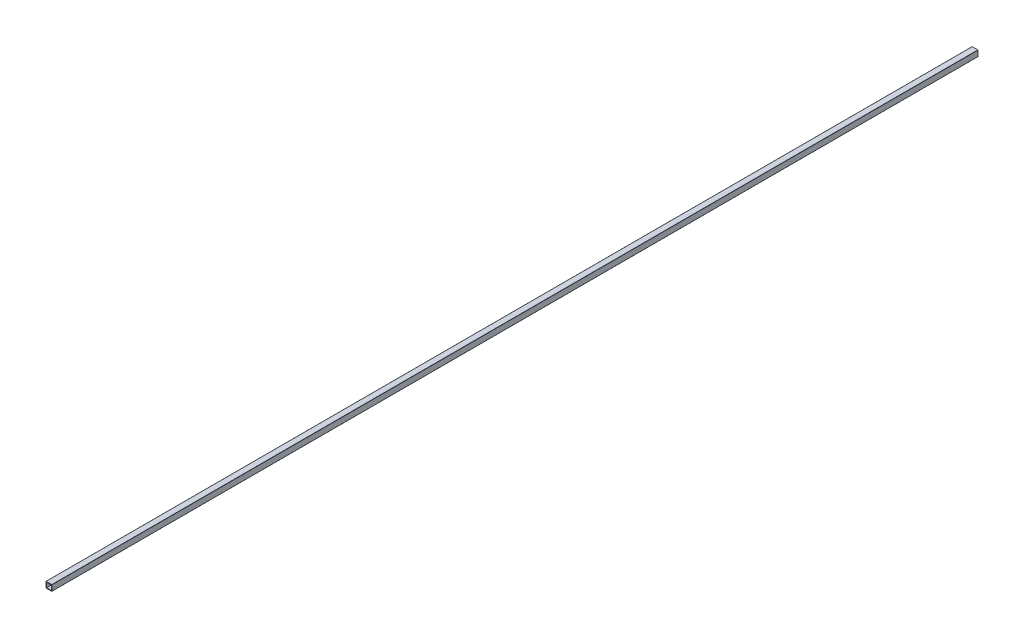
ISO-10303-21;
HEADER;
FILE_DESCRIPTION(('STEP AP214'),'2;1');
FILE_NAME('part.step','',(''),(''),'','','');
FILE_SCHEMA(('AUTOMOTIVE_DESIGN { 1 0 10303 214 1 1 1 1 }'));
ENDSEC;
DATA;
#1=APPLICATION_CONTEXT('core data for automotive mechanical design processes');
#2=APPLICATION_PROTOCOL_DEFINITION('international standard','automotive_design',2000,#1);
#3=PRODUCT_CONTEXT('',#1,'mechanical');
#4=PRODUCT('Part','Part','',(#3));
#5=PRODUCT_RELATED_PRODUCT_CATEGORY('part','',(#4));
#6=PRODUCT_DEFINITION_FORMATION('','',#4);
#7=PRODUCT_DEFINITION_CONTEXT('part definition',#1,'design');
#8=PRODUCT_DEFINITION('design','',#6,#7);
#9=PRODUCT_DEFINITION_SHAPE('','',#8);
#10=(LENGTH_UNIT() NAMED_UNIT(*) SI_UNIT(.MILLI.,.METRE.));
#11=(NAMED_UNIT(*) PLANE_ANGLE_UNIT() SI_UNIT($,.RADIAN.));
#12=(NAMED_UNIT(*) SI_UNIT($,.STERADIAN.) SOLID_ANGLE_UNIT());
#13=UNCERTAINTY_MEASURE_WITH_UNIT(LENGTH_MEASURE(1.E-05),#10,'distance_accuracy_value','');
#14=(GEOMETRIC_REPRESENTATION_CONTEXT(3) GLOBAL_UNCERTAINTY_ASSIGNED_CONTEXT((#13)) GLOBAL_UNIT_ASSIGNED_CONTEXT((#10,
#11,#12)) REPRESENTATION_CONTEXT('',''));
#15=CARTESIAN_POINT('',(0.,0.,0.));
#16=DIRECTION('',(0.,0.,1.));
#17=DIRECTION('',(1.,0.,0.));
#18=AXIS2_PLACEMENT_3D('',#15,#16,#17);
#19=CARTESIAN_POINT('',(18.05,18.05,6000.));
#20=DIRECTION('',(0.,0.,-1.));
#21=DIRECTION('',(-1.,0.,0.));
#22=AXIS2_PLACEMENT_3D('',#19,#20,#21);
#23=PLANE('',#22);
#24=CARTESIAN_POINT('',(18.05,18.05,6000.));
#25=DIRECTION('',(0.,0.,1.));
#26=DIRECTION('',(-1.,0.,0.));
#27=AXIS2_PLACEMENT_3D('',#24,#25,#26);
#28=CIRCLE('',#27,1.);
#29=CARTESIAN_POINT('',(19.05,18.05,6000.));
#30=VERTEX_POINT('',#29);
#31=CARTESIAN_POINT('',(18.05,19.05,6000.));
#32=VERTEX_POINT('',#31);
#33=EDGE_CURVE('E158',#30,#32,#28,.T.);
#34=ORIENTED_EDGE('',*,*,#33,.T.);
#35=DIRECTION('',(-1.,0.,0.));
#36=VECTOR('',#35,1.);
#37=CARTESIAN_POINT('',(-18.05,19.05,6000.));
#38=LINE('',#37,#36);
#39=CARTESIAN_POINT('',(-18.05,19.05,6000.));
#40=VERTEX_POINT('',#39);
#41=EDGE_CURVE('E161',#32,#40,#38,.T.);
#42=ORIENTED_EDGE('',*,*,#41,.T.);
#43=CARTESIAN_POINT('',(-18.05,18.05,6000.));
#44=DIRECTION('',(0.,0.,1.));
#45=DIRECTION('',(-1.,0.,0.));
#46=AXIS2_PLACEMENT_3D('',#43,#44,#45);
#47=CIRCLE('',#46,1.);
#48=CARTESIAN_POINT('',(-19.05,18.05,6000.));
#49=VERTEX_POINT('',#48);
#50=EDGE_CURVE('E164',#40,#49,#47,.T.);
#51=ORIENTED_EDGE('',*,*,#50,.T.);
#52=DIRECTION('',(0.,-1.,0.));
#53=VECTOR('',#52,1.);
#54=CARTESIAN_POINT('',(-19.05,-18.05,6000.));
#55=LINE('',#54,#53);
#56=CARTESIAN_POINT('',(-19.05,-18.05,6000.));
#57=VERTEX_POINT('',#56);
#58=EDGE_CURVE('E166',#49,#57,#55,.T.);
#59=ORIENTED_EDGE('',*,*,#58,.T.);
#60=CARTESIAN_POINT('',(-18.05,-18.05,6000.));
#61=DIRECTION('',(0.,0.,1.));
#62=DIRECTION('',(-1.,0.,0.));
#63=AXIS2_PLACEMENT_3D('',#60,#61,#62);
#64=CIRCLE('',#63,1.);
#65=CARTESIAN_POINT('',(-18.05,-19.05,6000.));
#66=VERTEX_POINT('',#65);
#67=EDGE_CURVE('E168',#57,#66,#64,.T.);
#68=ORIENTED_EDGE('',*,*,#67,.T.);
#69=DIRECTION('',(1.,0.,0.));
#70=VECTOR('',#69,1.);
#71=CARTESIAN_POINT('',(-18.05,-19.05,6000.));
#72=LINE('',#71,#70);
#73=CARTESIAN_POINT('',(18.05,-19.05,6000.));
#74=VERTEX_POINT('',#73);
#75=EDGE_CURVE('E170',#66,#74,#72,.T.);
#76=ORIENTED_EDGE('',*,*,#75,.T.);
#77=CARTESIAN_POINT('',(18.05,-18.05,6000.));
#78=DIRECTION('',(0.,0.,1.));
#79=DIRECTION('',(1.,0.,0.));
#80=AXIS2_PLACEMENT_3D('',#77,#78,#79);
#81=CIRCLE('',#80,1.);
#82=CARTESIAN_POINT('',(19.05,-18.05,6000.));
#83=VERTEX_POINT('',#82);
#84=EDGE_CURVE('E172',#74,#83,#81,.T.);
#85=ORIENTED_EDGE('',*,*,#84,.T.);
#86=DIRECTION('',(0.,1.,0.));
#87=VECTOR('',#86,1.);
#88=CARTESIAN_POINT('',(19.05,-18.05,6000.));
#89=LINE('',#88,#87);
#90=EDGE_CURVE('E174',#83,#30,#89,.T.);
#91=ORIENTED_EDGE('',*,*,#90,.T.);
#92=EDGE_LOOP('',(#34,#42,#51,#59,#68,#76,#85,#91));
#93=FACE_BOUND('',#92,.T.);
#94=DIRECTION('',(1.,0.,0.));
#95=VECTOR('',#94,1.);
#96=CARTESIAN_POINT('',(-15.25,-15.25,6000.));
#97=LINE('',#96,#95);
#98=CARTESIAN_POINT('',(-15.25,-15.25,6000.));
#99=VERTEX_POINT('',#98);
#100=CARTESIAN_POINT('',(15.25,-15.25,6000.));
#101=VERTEX_POINT('',#100);
#102=EDGE_CURVE('E122',#99,#101,#97,.T.);
#103=ORIENTED_EDGE('',*,*,#102,.F.);
#104=DIRECTION('',(0.,-1.,0.));
#105=VECTOR('',#104,1.);
#106=CARTESIAN_POINT('',(-15.25,-15.25,6000.));
#107=LINE('',#106,#105);
#108=CARTESIAN_POINT('',(-15.25,15.25,6000.));
#109=VERTEX_POINT('',#108);
#110=EDGE_CURVE('E144',#109,#99,#107,.T.);
#111=ORIENTED_EDGE('',*,*,#110,.F.);
#112=DIRECTION('',(-1.,0.,0.));
#113=VECTOR('',#112,1.);
#114=CARTESIAN_POINT('',(-15.25,15.25,6000.));
#115=LINE('',#114,#113);
#116=CARTESIAN_POINT('',(15.25,15.25,6000.));
#117=VERTEX_POINT('',#116);
#118=EDGE_CURVE('E142',#117,#109,#115,.T.);
#119=ORIENTED_EDGE('',*,*,#118,.F.);
#120=DIRECTION('',(0.,1.,0.));
#121=VECTOR('',#120,1.);
#122=CARTESIAN_POINT('',(15.25,-15.25,6000.));
#123=LINE('',#122,#121);
#124=EDGE_CURVE('E130',#101,#117,#123,.T.);
#125=ORIENTED_EDGE('',*,*,#124,.F.);
#126=EDGE_LOOP('',(#103,#111,#119,#125));
#127=FACE_BOUND('',#126,.T.);
#128=ADVANCED_FACE('F33',(#93,#127),#23,.F.);
#129=CARTESIAN_POINT('',(18.05,18.05,0.));
#130=DIRECTION('',(0.,0.,-1.));
#131=DIRECTION('',(-1.,0.,0.));
#132=AXIS2_PLACEMENT_3D('',#129,#130,#131);
#133=PLANE('',#132);
#134=CARTESIAN_POINT('',(18.05,18.05,0.));
#135=DIRECTION('',(0.,0.,1.));
#136=DIRECTION('',(-1.,0.,0.));
#137=AXIS2_PLACEMENT_3D('',#134,#135,#136);
#138=CIRCLE('',#137,1.);
#139=CARTESIAN_POINT('',(19.05,18.05,0.));
#140=VERTEX_POINT('',#139);
#141=CARTESIAN_POINT('',(18.05,19.05,0.));
#142=VERTEX_POINT('',#141);
#143=EDGE_CURVE('E138',#140,#142,#138,.T.);
#144=ORIENTED_EDGE('',*,*,#143,.F.);
#145=DIRECTION('',(0.,1.,0.));
#146=VECTOR('',#145,1.);
#147=CARTESIAN_POINT('',(19.05,-18.05,0.));
#148=LINE('',#147,#146);
#149=CARTESIAN_POINT('',(19.05,-18.05,0.));
#150=VERTEX_POINT('',#149);
#151=EDGE_CURVE('E162',#150,#140,#148,.T.);
#152=ORIENTED_EDGE('',*,*,#151,.F.);
#153=CARTESIAN_POINT('',(18.05,-18.05,0.));
#154=DIRECTION('',(0.,0.,1.));
#155=DIRECTION('',(1.,0.,0.));
#156=AXIS2_PLACEMENT_3D('',#153,#154,#155);
#157=CIRCLE('',#156,1.);
#158=CARTESIAN_POINT('',(18.05,-19.05,0.));
#159=VERTEX_POINT('',#158);
#160=EDGE_CURVE('E189',#159,#150,#157,.T.);
#161=ORIENTED_EDGE('',*,*,#160,.F.);
#162=DIRECTION('',(1.,0.,0.));
#163=VECTOR('',#162,1.);
#164=CARTESIAN_POINT('',(-18.05,-19.05,0.));
#165=LINE('',#164,#163);
#166=CARTESIAN_POINT('',(-18.05,-19.05,0.));
#167=VERTEX_POINT('',#166);
#168=EDGE_CURVE('E187',#167,#159,#165,.T.);
#169=ORIENTED_EDGE('',*,*,#168,.F.);
#170=CARTESIAN_POINT('',(-18.05,-18.05,0.));
#171=DIRECTION('',(0.,0.,1.));
#172=DIRECTION('',(-1.,0.,0.));
#173=AXIS2_PLACEMENT_3D('',#170,#171,#172);
#174=CIRCLE('',#173,1.);
#175=CARTESIAN_POINT('',(-19.05,-18.05,0.));
#176=VERTEX_POINT('',#175);
#177=EDGE_CURVE('E185',#176,#167,#174,.T.);
#178=ORIENTED_EDGE('',*,*,#177,.F.);
#179=DIRECTION('',(0.,-1.,0.));
#180=VECTOR('',#179,1.);
#181=CARTESIAN_POINT('',(-19.05,-18.05,0.));
#182=LINE('',#181,#180);
#183=CARTESIAN_POINT('',(-19.05,18.05,0.));
#184=VERTEX_POINT('',#183);
#185=EDGE_CURVE('E183',#184,#176,#182,.T.);
#186=ORIENTED_EDGE('',*,*,#185,.F.);
#187=CARTESIAN_POINT('',(-18.05,18.05,0.));
#188=DIRECTION('',(0.,0.,1.));
#189=DIRECTION('',(-1.,0.,0.));
#190=AXIS2_PLACEMENT_3D('',#187,#188,#189);
#191=CIRCLE('',#190,1.);
#192=CARTESIAN_POINT('',(-18.05,19.05,0.));
#193=VERTEX_POINT('',#192);
#194=EDGE_CURVE('E181',#193,#184,#191,.T.);
#195=ORIENTED_EDGE('',*,*,#194,.F.);
#196=DIRECTION('',(-1.,0.,0.));
#197=VECTOR('',#196,1.);
#198=CARTESIAN_POINT('',(-18.05,19.05,0.));
#199=LINE('',#198,#197);
#200=EDGE_CURVE('E179',#142,#193,#199,.T.);
#201=ORIENTED_EDGE('',*,*,#200,.F.);
#202=EDGE_LOOP('',(#144,#152,#161,#169,#178,#186,#195,#201));
#203=FACE_BOUND('',#202,.T.);
#204=DIRECTION('',(0.,-1.,0.));
#205=VECTOR('',#204,1.);
#206=CARTESIAN_POINT('',(-15.25,-15.25,0.));
#207=LINE('',#206,#205);
#208=CARTESIAN_POINT('',(-15.25,15.25,0.));
#209=VERTEX_POINT('',#208);
#210=CARTESIAN_POINT('',(-15.25,-15.25,0.));
#211=VERTEX_POINT('',#210);
#212=EDGE_CURVE('E131',#209,#211,#207,.T.);
#213=ORIENTED_EDGE('',*,*,#212,.T.);
#214=DIRECTION('',(1.,0.,0.));
#215=VECTOR('',#214,1.);
#216=CARTESIAN_POINT('',(-15.25,-15.25,0.));
#217=LINE('',#216,#215);
#218=CARTESIAN_POINT('',(15.25,-15.25,0.));
#219=VERTEX_POINT('',#218);
#220=EDGE_CURVE('E56',#211,#219,#217,.T.);
#221=ORIENTED_EDGE('',*,*,#220,.T.);
#222=DIRECTION('',(0.,1.,0.));
#223=VECTOR('',#222,1.);
#224=CARTESIAN_POINT('',(15.25,-15.25,0.));
#225=LINE('',#224,#223);
#226=CARTESIAN_POINT('',(15.25,15.25,0.));
#227=VERTEX_POINT('',#226);
#228=EDGE_CURVE('E137',#219,#227,#225,.T.);
#229=ORIENTED_EDGE('',*,*,#228,.T.);
#230=DIRECTION('',(-1.,0.,0.));
#231=VECTOR('',#230,1.);
#232=CARTESIAN_POINT('',(-15.25,15.25,0.));
#233=LINE('',#232,#231);
#234=EDGE_CURVE('E150',#227,#209,#233,.T.);
#235=ORIENTED_EDGE('',*,*,#234,.T.);
#236=EDGE_LOOP('',(#213,#221,#229,#235));
#237=FACE_BOUND('',#236,.T.);
#238=ADVANCED_FACE('F219',(#203,#237),#133,.T.);
#239=CARTESIAN_POINT('',(18.05,18.05,6000.));
#240=DIRECTION('',(0.,0.,-1.));
#241=DIRECTION('',(-1.,0.,0.));
#242=AXIS2_PLACEMENT_3D('',#239,#240,#241);
#243=CYLINDRICAL_SURFACE('',#242,1.);
#244=ORIENTED_EDGE('',*,*,#143,.T.);
#245=DIRECTION('',(0.,0.,-1.));
#246=VECTOR('',#245,1.);
#247=CARTESIAN_POINT('',(18.05,19.05,6000.));
#248=LINE('',#247,#246);
#249=EDGE_CURVE('E11',#32,#142,#248,.T.);
#250=ORIENTED_EDGE('',*,*,#249,.F.);
#251=ORIENTED_EDGE('',*,*,#33,.F.);
#252=DIRECTION('',(0.,0.,-1.));
#253=VECTOR('',#252,1.);
#254=CARTESIAN_POINT('',(19.05,18.05,6000.));
#255=LINE('',#254,#253);
#256=EDGE_CURVE('E176',#30,#140,#255,.T.);
#257=ORIENTED_EDGE('',*,*,#256,.T.);
#258=EDGE_LOOP('',(#244,#250,#251,#257));
#259=FACE_BOUND('',#258,.T.);
#260=ADVANCED_FACE('F35',(#259),#243,.T.);
#261=CARTESIAN_POINT('',(-18.05,19.05,6000.));
#262=DIRECTION('',(0.,-1.,0.));
#263=DIRECTION('',(0.,0.,-1.));
#264=AXIS2_PLACEMENT_3D('',#261,#262,#263);
#265=PLANE('',#264);
#266=ORIENTED_EDGE('',*,*,#200,.T.);
#267=DIRECTION('',(0.,0.,-1.));
#268=VECTOR('',#267,1.);
#269=CARTESIAN_POINT('',(-18.05,19.05,6000.));
#270=LINE('',#269,#268);
#271=EDGE_CURVE('E41',#40,#193,#270,.T.);
#272=ORIENTED_EDGE('',*,*,#271,.F.);
#273=ORIENTED_EDGE('',*,*,#41,.F.);
#274=ORIENTED_EDGE('',*,*,#249,.T.);
#275=EDGE_LOOP('',(#266,#272,#273,#274));
#276=FACE_BOUND('',#275,.T.);
#277=ADVANCED_FACE('F236',(#276),#265,.F.);
#278=CARTESIAN_POINT('',(-18.05,18.05,6000.));
#279=DIRECTION('',(0.,0.,-1.));
#280=DIRECTION('',(-1.,0.,0.));
#281=AXIS2_PLACEMENT_3D('',#278,#279,#280);
#282=CYLINDRICAL_SURFACE('',#281,1.);
#283=ORIENTED_EDGE('',*,*,#194,.T.);
#284=DIRECTION('',(0.,0.,-1.));
#285=VECTOR('',#284,1.);
#286=CARTESIAN_POINT('',(-19.05,18.05,6000.));
#287=LINE('',#286,#285);
#288=EDGE_CURVE('E206',#49,#184,#287,.T.);
#289=ORIENTED_EDGE('',*,*,#288,.F.);
#290=ORIENTED_EDGE('',*,*,#50,.F.);
#291=ORIENTED_EDGE('',*,*,#271,.T.);
#292=EDGE_LOOP('',(#283,#289,#290,#291));
#293=FACE_BOUND('',#292,.T.);
#294=ADVANCED_FACE('F213',(#293),#282,.T.);
#295=CARTESIAN_POINT('',(-19.05,-18.05,6000.));
#296=DIRECTION('',(1.,0.,0.));
#297=DIRECTION('',(0.,0.,-1.));
#298=AXIS2_PLACEMENT_3D('',#295,#296,#297);
#299=PLANE('',#298);
#300=ORIENTED_EDGE('',*,*,#185,.T.);
#301=DIRECTION('',(0.,0.,-1.));
#302=VECTOR('',#301,1.);
#303=CARTESIAN_POINT('',(-19.05,-18.05,6000.));
#304=LINE('',#303,#302);
#305=EDGE_CURVE('E203',#57,#176,#304,.T.);
#306=ORIENTED_EDGE('',*,*,#305,.F.);
#307=ORIENTED_EDGE('',*,*,#58,.F.);
#308=ORIENTED_EDGE('',*,*,#288,.T.);
#309=EDGE_LOOP('',(#300,#306,#307,#308));
#310=FACE_BOUND('',#309,.T.);
#311=ADVANCED_FACE('F225',(#310),#299,.F.);
#312=CARTESIAN_POINT('',(-18.05,-18.05,6000.));
#313=DIRECTION('',(0.,0.,-1.));
#314=DIRECTION('',(-1.,0.,0.));
#315=AXIS2_PLACEMENT_3D('',#312,#313,#314);
#316=CYLINDRICAL_SURFACE('',#315,1.);
#317=ORIENTED_EDGE('',*,*,#177,.T.);
#318=DIRECTION('',(0.,0.,-1.));
#319=VECTOR('',#318,1.);
#320=CARTESIAN_POINT('',(-18.05,-19.05,6000.));
#321=LINE('',#320,#319);
#322=EDGE_CURVE('E200',#66,#167,#321,.T.);
#323=ORIENTED_EDGE('',*,*,#322,.F.);
#324=ORIENTED_EDGE('',*,*,#67,.F.);
#325=ORIENTED_EDGE('',*,*,#305,.T.);
#326=EDGE_LOOP('',(#317,#323,#324,#325));
#327=FACE_BOUND('',#326,.T.);
#328=ADVANCED_FACE('F229',(#327),#316,.T.);
#329=CARTESIAN_POINT('',(-18.05,-19.05,6000.));
#330=DIRECTION('',(0.,1.,0.));
#331=DIRECTION('',(0.,0.,1.));
#332=AXIS2_PLACEMENT_3D('',#329,#330,#331);
#333=PLANE('',#332);
#334=ORIENTED_EDGE('',*,*,#168,.T.);
#335=DIRECTION('',(0.,0.,-1.));
#336=VECTOR('',#335,1.);
#337=CARTESIAN_POINT('',(18.05,-19.05,6000.));
#338=LINE('',#337,#336);
#339=EDGE_CURVE('E197',#74,#159,#338,.T.);
#340=ORIENTED_EDGE('',*,*,#339,.F.);
#341=ORIENTED_EDGE('',*,*,#75,.F.);
#342=ORIENTED_EDGE('',*,*,#322,.T.);
#343=EDGE_LOOP('',(#334,#340,#341,#342));
#344=FACE_BOUND('',#343,.T.);
#345=ADVANCED_FACE('F249',(#344),#333,.F.);
#346=CARTESIAN_POINT('',(18.05,-18.05,6000.));
#347=DIRECTION('',(0.,0.,-1.));
#348=DIRECTION('',(-1.,0.,0.));
#349=AXIS2_PLACEMENT_3D('',#346,#347,#348);
#350=CYLINDRICAL_SURFACE('',#349,1.);
#351=ORIENTED_EDGE('',*,*,#160,.T.);
#352=DIRECTION('',(0.,0.,-1.));
#353=VECTOR('',#352,1.);
#354=CARTESIAN_POINT('',(19.05,-18.05,6000.));
#355=LINE('',#354,#353);
#356=EDGE_CURVE('E194',#83,#150,#355,.T.);
#357=ORIENTED_EDGE('',*,*,#356,.F.);
#358=ORIENTED_EDGE('',*,*,#84,.F.);
#359=ORIENTED_EDGE('',*,*,#339,.T.);
#360=EDGE_LOOP('',(#351,#357,#358,#359));
#361=FACE_BOUND('',#360,.T.);
#362=ADVANCED_FACE('F247',(#361),#350,.T.);
#363=CARTESIAN_POINT('',(19.05,-18.05,6000.));
#364=DIRECTION('',(-1.,0.,0.));
#365=DIRECTION('',(0.,0.,1.));
#366=AXIS2_PLACEMENT_3D('',#363,#364,#365);
#367=PLANE('',#366);
#368=ORIENTED_EDGE('',*,*,#151,.T.);
#369=ORIENTED_EDGE('',*,*,#256,.F.);
#370=ORIENTED_EDGE('',*,*,#90,.F.);
#371=ORIENTED_EDGE('',*,*,#356,.T.);
#372=EDGE_LOOP('',(#368,#369,#370,#371));
#373=FACE_BOUND('',#372,.T.);
#374=ADVANCED_FACE('F242',(#373),#367,.F.);
#375=CARTESIAN_POINT('',(-15.25,-15.25,6000.));
#376=DIRECTION('',(0.,1.,0.));
#377=DIRECTION('',(0.,0.,1.));
#378=AXIS2_PLACEMENT_3D('',#375,#376,#377);
#379=PLANE('',#378);
#380=ORIENTED_EDGE('',*,*,#220,.F.);
#381=DIRECTION('',(0.,0.,-1.));
#382=VECTOR('',#381,1.);
#383=CARTESIAN_POINT('',(-15.25,-15.25,6000.));
#384=LINE('',#383,#382);
#385=EDGE_CURVE('E126',#99,#211,#384,.T.);
#386=ORIENTED_EDGE('',*,*,#385,.F.);
#387=ORIENTED_EDGE('',*,*,#102,.T.);
#388=DIRECTION('',(0.,0.,-1.));
#389=VECTOR('',#388,1.);
#390=CARTESIAN_POINT('',(15.25,-15.25,6000.));
#391=LINE('',#390,#389);
#392=EDGE_CURVE('E125',#101,#219,#391,.T.);
#393=ORIENTED_EDGE('',*,*,#392,.T.);
#394=EDGE_LOOP('',(#380,#386,#387,#393));
#395=FACE_BOUND('',#394,.T.);
#396=ADVANCED_FACE('F124',(#395),#379,.T.);
#397=CARTESIAN_POINT('',(15.25,-15.25,6000.));
#398=DIRECTION('',(-1.,0.,0.));
#399=DIRECTION('',(0.,-1.,0.));
#400=AXIS2_PLACEMENT_3D('',#397,#398,#399);
#401=PLANE('',#400);
#402=ORIENTED_EDGE('',*,*,#228,.F.);
#403=ORIENTED_EDGE('',*,*,#392,.F.);
#404=ORIENTED_EDGE('',*,*,#124,.T.);
#405=DIRECTION('',(0.,0.,-1.));
#406=VECTOR('',#405,1.);
#407=CARTESIAN_POINT('',(15.25,15.25,6000.));
#408=LINE('',#407,#406);
#409=EDGE_CURVE('E139',#117,#227,#408,.T.);
#410=ORIENTED_EDGE('',*,*,#409,.T.);
#411=EDGE_LOOP('',(#402,#403,#404,#410));
#412=FACE_BOUND('',#411,.T.);
#413=ADVANCED_FACE('F134',(#412),#401,.T.);
#414=CARTESIAN_POINT('',(-15.25,15.25,6000.));
#415=DIRECTION('',(0.,-1.,0.));
#416=DIRECTION('',(1.,0.,0.));
#417=AXIS2_PLACEMENT_3D('',#414,#415,#416);
#418=PLANE('',#417);
#419=ORIENTED_EDGE('',*,*,#234,.F.);
#420=ORIENTED_EDGE('',*,*,#409,.F.);
#421=ORIENTED_EDGE('',*,*,#118,.T.);
#422=DIRECTION('',(0.,0.,-1.));
#423=VECTOR('',#422,1.);
#424=CARTESIAN_POINT('',(-15.25,15.25,6000.));
#425=LINE('',#424,#423);
#426=EDGE_CURVE('E48',#109,#209,#425,.T.);
#427=ORIENTED_EDGE('',*,*,#426,.T.);
#428=EDGE_LOOP('',(#419,#420,#421,#427));
#429=FACE_BOUND('',#428,.T.);
#430=ADVANCED_FACE('F274',(#429),#418,.T.);
#431=CARTESIAN_POINT('',(-15.25,-15.25,6000.));
#432=DIRECTION('',(1.,0.,0.));
#433=DIRECTION('',(0.,0.,-1.));
#434=AXIS2_PLACEMENT_3D('',#431,#432,#433);
#435=PLANE('',#434);
#436=ORIENTED_EDGE('',*,*,#212,.F.);
#437=ORIENTED_EDGE('',*,*,#426,.F.);
#438=ORIENTED_EDGE('',*,*,#110,.T.);
#439=ORIENTED_EDGE('',*,*,#385,.T.);
#440=EDGE_LOOP('',(#436,#437,#438,#439));
#441=FACE_BOUND('',#440,.T.);
#442=ADVANCED_FACE('F278',(#441),#435,.T.);
#443=CLOSED_SHELL('',(#128,#238,#260,#277,#294,#311,#328,#345,#362,#374,#396,#413,#430,#442));
#444=MANIFOLD_SOLID_BREP('B2',#443);
#445=ADVANCED_BREP_SHAPE_REPRESENTATION('',(#18,#444),#14);
#446=SHAPE_DEFINITION_REPRESENTATION(#9,#445);
ENDSEC;
END-ISO-10303-21;
